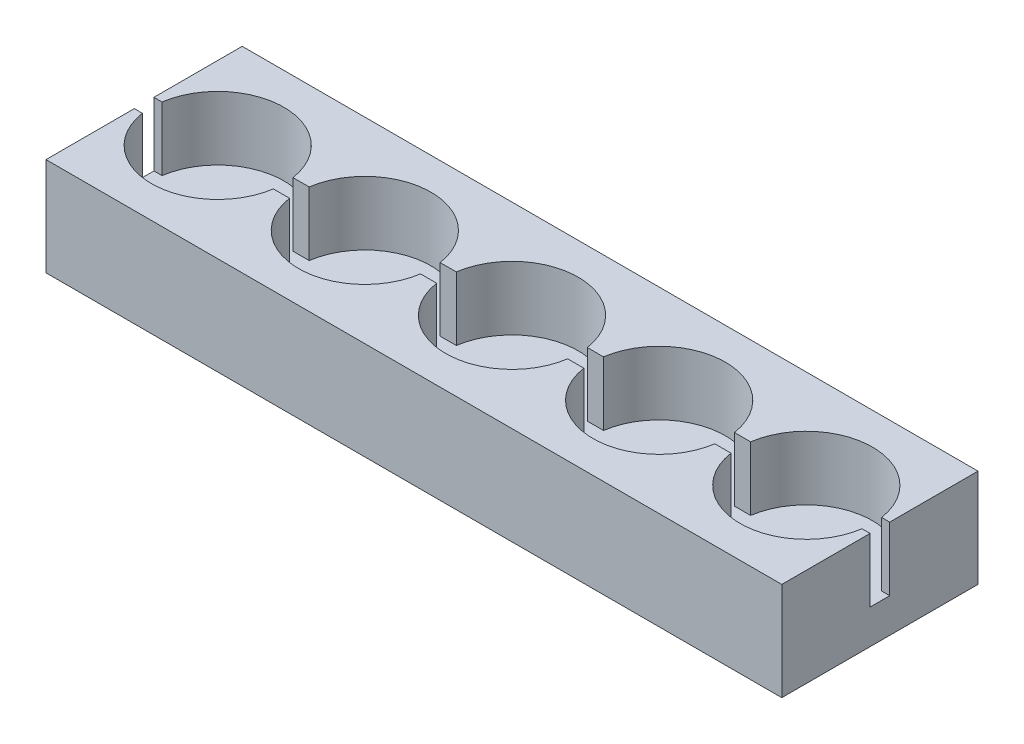
ISO-10303-21;
HEADER;
FILE_DESCRIPTION(('STEP AP214'),'2;1');
FILE_NAME('part.step','',(''),(''),'','','');
FILE_SCHEMA(('AUTOMOTIVE_DESIGN { 1 0 10303 214 1 1 1 1 }'));
ENDSEC;
DATA;
#1=APPLICATION_CONTEXT('core data for automotive mechanical design processes');
#2=APPLICATION_PROTOCOL_DEFINITION('international standard','automotive_design',2000,#1);
#3=PRODUCT_CONTEXT('',#1,'mechanical');
#4=PRODUCT('Part','Part','',(#3));
#5=PRODUCT_RELATED_PRODUCT_CATEGORY('part','',(#4));
#6=PRODUCT_DEFINITION_FORMATION('','',#4);
#7=PRODUCT_DEFINITION_CONTEXT('part definition',#1,'design');
#8=PRODUCT_DEFINITION('design','',#6,#7);
#9=PRODUCT_DEFINITION_SHAPE('','',#8);
#10=(LENGTH_UNIT() NAMED_UNIT(*) SI_UNIT(.MILLI.,.METRE.));
#11=(NAMED_UNIT(*) PLANE_ANGLE_UNIT() SI_UNIT($,.RADIAN.));
#12=(NAMED_UNIT(*) SI_UNIT($,.STERADIAN.) SOLID_ANGLE_UNIT());
#13=UNCERTAINTY_MEASURE_WITH_UNIT(LENGTH_MEASURE(1.E-05),#10,'distance_accuracy_value','');
#14=(GEOMETRIC_REPRESENTATION_CONTEXT(3) GLOBAL_UNCERTAINTY_ASSIGNED_CONTEXT((#13)) GLOBAL_UNIT_ASSIGNED_CONTEXT((#10,
#11,#12)) REPRESENTATION_CONTEXT('',''));
#15=CARTESIAN_POINT('',(0.,0.,0.));
#16=DIRECTION('',(0.,0.,1.));
#17=DIRECTION('',(1.,0.,0.));
#18=AXIS2_PLACEMENT_3D('',#15,#16,#17);
#19=CARTESIAN_POINT('',(75.,20.,20.));
#20=DIRECTION('',(0.,1.,0.));
#21=DIRECTION('',(0.,0.,1.));
#22=AXIS2_PLACEMENT_3D('',#19,#20,#21);
#23=PLANE('',#22);
#24=DIRECTION('',(1.,0.,0.));
#25=VECTOR('',#24,1.);
#26=CARTESIAN_POINT('',(-90.5645069148307,20.,2.));
#27=LINE('',#26,#25);
#28=CARTESIAN_POINT('',(-75.,20.,2.));
#29=VERTEX_POINT('',#28);
#30=CARTESIAN_POINT('',(-73.3510299228187,20.,2.));
#31=VERTEX_POINT('',#30);
#32=EDGE_CURVE('E365',#29,#31,#27,.T.);
#33=ORIENTED_EDGE('',*,*,#32,.F.);
#34=DIRECTION('',(0.,0.,1.));
#35=VECTOR('',#34,1.);
#36=CARTESIAN_POINT('',(-75.,20.,-20.));
#37=LINE('',#36,#35);
#38=CARTESIAN_POINT('',(-75.,20.,20.));
#39=VERTEX_POINT('',#38);
#40=EDGE_CURVE('E239',#29,#39,#37,.T.);
#41=ORIENTED_EDGE('',*,*,#40,.T.);
#42=DIRECTION('',(1.,0.,0.));
#43=VECTOR('',#42,1.);
#44=CARTESIAN_POINT('',(-75.,20.,20.));
#45=LINE('',#44,#43);
#46=CARTESIAN_POINT('',(75.,20.,20.));
#47=VERTEX_POINT('',#46);
#48=EDGE_CURVE('E296',#39,#47,#45,.T.);
#49=ORIENTED_EDGE('',*,*,#48,.T.);
#50=DIRECTION('',(0.,0.,-1.));
#51=VECTOR('',#50,1.);
#52=CARTESIAN_POINT('',(75.,20.,-20.));
#53=LINE('',#52,#51);
#54=CARTESIAN_POINT('',(75.,20.,2.));
#55=VERTEX_POINT('',#54);
#56=EDGE_CURVE('E287',#47,#55,#53,.T.);
#57=ORIENTED_EDGE('',*,*,#56,.T.);
#58=CARTESIAN_POINT('',(73.3510299228186,20.,2.));
#59=VERTEX_POINT('',#58);
#60=EDGE_CURVE('E360',#59,#55,#27,.T.);
#61=ORIENTED_EDGE('',*,*,#60,.F.);
#62=CARTESIAN_POINT('',(60.,20.,0.));
#63=DIRECTION('',(0.,1.,0.));
#64=DIRECTION('',(0.,0.,1.));
#65=AXIS2_PLACEMENT_3D('',#62,#63,#64);
#66=CIRCLE('',#65,13.5);
#67=CARTESIAN_POINT('',(46.6489700771813,20.,2.));
#68=VERTEX_POINT('',#67);
#69=EDGE_CURVE('E335',#68,#59,#66,.T.);
#70=ORIENTED_EDGE('',*,*,#69,.F.);
#71=CARTESIAN_POINT('',(43.3510299228186,20.,2.));
#72=VERTEX_POINT('',#71);
#73=EDGE_CURVE('E359',#72,#68,#27,.T.);
#74=ORIENTED_EDGE('',*,*,#73,.F.);
#75=CARTESIAN_POINT('',(30.,20.,0.));
#76=DIRECTION('',(0.,1.,0.));
#77=DIRECTION('',(0.,0.,1.));
#78=AXIS2_PLACEMENT_3D('',#75,#76,#77);
#79=CIRCLE('',#78,13.5);
#80=CARTESIAN_POINT('',(16.6489700771813,20.,2.));
#81=VERTEX_POINT('',#80);
#82=EDGE_CURVE('E327',#81,#72,#79,.T.);
#83=ORIENTED_EDGE('',*,*,#82,.F.);
#84=CARTESIAN_POINT('',(13.3510299228186,20.,2.));
#85=VERTEX_POINT('',#84);
#86=EDGE_CURVE('E366',#85,#81,#27,.T.);
#87=ORIENTED_EDGE('',*,*,#86,.F.);
#88=CARTESIAN_POINT('',(0.,20.,0.));
#89=DIRECTION('',(0.,1.,0.));
#90=DIRECTION('',(0.,0.,1.));
#91=AXIS2_PLACEMENT_3D('',#88,#89,#90);
#92=CIRCLE('',#91,13.5);
#93=CARTESIAN_POINT('',(-13.3510299228187,20.,2.));
#94=VERTEX_POINT('',#93);
#95=EDGE_CURVE('E319',#94,#85,#92,.T.);
#96=ORIENTED_EDGE('',*,*,#95,.F.);
#97=CARTESIAN_POINT('',(-16.6489700771813,20.,2.));
#98=VERTEX_POINT('',#97);
#99=EDGE_CURVE('E374',#98,#94,#27,.T.);
#100=ORIENTED_EDGE('',*,*,#99,.F.);
#101=CARTESIAN_POINT('',(-30.,20.,0.));
#102=DIRECTION('',(0.,1.,0.));
#103=DIRECTION('',(0.,0.,1.));
#104=AXIS2_PLACEMENT_3D('',#101,#102,#103);
#105=CIRCLE('',#104,13.5);
#106=CARTESIAN_POINT('',(-43.3510299228187,20.,2.));
#107=VERTEX_POINT('',#106);
#108=EDGE_CURVE('E273',#107,#98,#105,.T.);
#109=ORIENTED_EDGE('',*,*,#108,.F.);
#110=CARTESIAN_POINT('',(-46.6489700771813,20.,2.));
#111=VERTEX_POINT('',#110);
#112=EDGE_CURVE('E370',#111,#107,#27,.T.);
#113=ORIENTED_EDGE('',*,*,#112,.F.);
#114=CARTESIAN_POINT('',(-60.,20.,0.));
#115=DIRECTION('',(0.,1.,0.));
#116=DIRECTION('',(0.,0.,1.));
#117=AXIS2_PLACEMENT_3D('',#114,#115,#116);
#118=CIRCLE('',#117,13.5);
#119=EDGE_CURVE('E284',#31,#111,#118,.T.);
#120=ORIENTED_EDGE('',*,*,#119,.F.);
#121=EDGE_LOOP('',(#33,#41,#49,#57,#61,#70,#74,#83,#87,#96,#100,#109,#113,#120));
#122=FACE_BOUND('',#121,.T.);
#123=ADVANCED_FACE('F33',(#122),#23,.T.);
#124=CARTESIAN_POINT('',(-60.,7.,0.));
#125=DIRECTION('',(0.,1.,0.));
#126=DIRECTION('',(0.,0.,1.));
#127=AXIS2_PLACEMENT_3D('',#124,#125,#126);
#128=CYLINDRICAL_SURFACE('',#127,13.5);
#129=ORIENTED_EDGE('',*,*,#119,.T.);
#130=DIRECTION('',(0.,1.,0.));
#131=VECTOR('',#130,1.);
#132=CARTESIAN_POINT('',(-46.6489700771814,7.,2.));
#133=LINE('',#132,#131);
#134=CARTESIAN_POINT('',(-46.6489700771813,7.,2.));
#135=VERTEX_POINT('',#134);
#136=EDGE_CURVE('E241',#111,#135,#133,.F.);
#137=ORIENTED_EDGE('',*,*,#136,.T.);
#138=CARTESIAN_POINT('',(-60.,7.,0.));
#139=DIRECTION('',(0.,1.,0.));
#140=DIRECTION('',(0.,0.,1.));
#141=AXIS2_PLACEMENT_3D('',#138,#139,#140);
#142=CIRCLE('',#141,13.5);
#143=CARTESIAN_POINT('',(-73.3510299228187,7.,2.));
#144=VERTEX_POINT('',#143);
#145=EDGE_CURVE('E280',#144,#135,#142,.T.);
#146=ORIENTED_EDGE('',*,*,#145,.F.);
#147=DIRECTION('',(0.,1.,0.));
#148=VECTOR('',#147,1.);
#149=CARTESIAN_POINT('',(-73.3510299228187,7.,2.));
#150=LINE('',#149,#148);
#151=EDGE_CURVE('E232',#144,#31,#150,.T.);
#152=ORIENTED_EDGE('',*,*,#151,.T.);
#153=EDGE_LOOP('',(#129,#137,#146,#152));
#154=FACE_BOUND('',#153,.T.);
#155=ADVANCED_FACE('F413',(#154),#128,.F.);
#156=CARTESIAN_POINT('',(-30.,7.,0.));
#157=DIRECTION('',(0.,1.,0.));
#158=DIRECTION('',(0.,0.,1.));
#159=AXIS2_PLACEMENT_3D('',#156,#157,#158);
#160=CYLINDRICAL_SURFACE('',#159,13.5);
#161=ORIENTED_EDGE('',*,*,#108,.T.);
#162=DIRECTION('',(0.,1.,0.));
#163=VECTOR('',#162,1.);
#164=CARTESIAN_POINT('',(-16.6489700771814,7.,2.));
#165=LINE('',#164,#163);
#166=CARTESIAN_POINT('',(-16.6489700771813,7.,2.));
#167=VERTEX_POINT('',#166);
#168=EDGE_CURVE('E409',#98,#167,#165,.F.);
#169=ORIENTED_EDGE('',*,*,#168,.T.);
#170=CARTESIAN_POINT('',(-30.,7.,0.));
#171=DIRECTION('',(0.,1.,0.));
#172=DIRECTION('',(0.,0.,1.));
#173=AXIS2_PLACEMENT_3D('',#170,#171,#172);
#174=CIRCLE('',#173,13.5);
#175=CARTESIAN_POINT('',(-43.3510299228187,7.,2.));
#176=VERTEX_POINT('',#175);
#177=EDGE_CURVE('E277',#176,#167,#174,.T.);
#178=ORIENTED_EDGE('',*,*,#177,.F.);
#179=DIRECTION('',(0.,1.,0.));
#180=VECTOR('',#179,1.);
#181=CARTESIAN_POINT('',(-43.3510299228187,7.,2.));
#182=LINE('',#181,#180);
#183=EDGE_CURVE('E407',#176,#107,#182,.T.);
#184=ORIENTED_EDGE('',*,*,#183,.T.);
#185=EDGE_LOOP('',(#161,#169,#178,#184));
#186=FACE_BOUND('',#185,.T.);
#187=ADVANCED_FACE('F416',(#186),#160,.F.);
#188=CARTESIAN_POINT('',(0.,7.,0.));
#189=DIRECTION('',(0.,1.,0.));
#190=DIRECTION('',(0.,0.,1.));
#191=AXIS2_PLACEMENT_3D('',#188,#189,#190);
#192=CYLINDRICAL_SURFACE('',#191,13.5);
#193=ORIENTED_EDGE('',*,*,#95,.T.);
#194=DIRECTION('',(0.,1.,0.));
#195=VECTOR('',#194,1.);
#196=CARTESIAN_POINT('',(13.3510299228186,7.,2.));
#197=LINE('',#196,#195);
#198=CARTESIAN_POINT('',(13.3510299228186,7.,2.));
#199=VERTEX_POINT('',#198);
#200=EDGE_CURVE('E390',#85,#199,#197,.F.);
#201=ORIENTED_EDGE('',*,*,#200,.T.);
#202=CARTESIAN_POINT('',(0.,7.,0.));
#203=DIRECTION('',(0.,1.,0.));
#204=DIRECTION('',(0.,0.,1.));
#205=AXIS2_PLACEMENT_3D('',#202,#203,#204);
#206=CIRCLE('',#205,13.5);
#207=CARTESIAN_POINT('',(-13.3510299228187,7.,2.));
#208=VERTEX_POINT('',#207);
#209=EDGE_CURVE('E323',#208,#199,#206,.T.);
#210=ORIENTED_EDGE('',*,*,#209,.F.);
#211=DIRECTION('',(0.,1.,0.));
#212=VECTOR('',#211,1.);
#213=CARTESIAN_POINT('',(-13.3510299228187,7.,2.));
#214=LINE('',#213,#212);
#215=EDGE_CURVE('E398',#208,#94,#214,.T.);
#216=ORIENTED_EDGE('',*,*,#215,.T.);
#217=EDGE_LOOP('',(#193,#201,#210,#216));
#218=FACE_BOUND('',#217,.T.);
#219=ADVANCED_FACE('F506',(#218),#192,.F.);
#220=CARTESIAN_POINT('',(30.,7.,0.));
#221=DIRECTION('',(0.,1.,0.));
#222=DIRECTION('',(0.,0.,1.));
#223=AXIS2_PLACEMENT_3D('',#220,#221,#222);
#224=CYLINDRICAL_SURFACE('',#223,13.5);
#225=ORIENTED_EDGE('',*,*,#82,.T.);
#226=DIRECTION('',(0.,1.,0.));
#227=VECTOR('',#226,1.);
#228=CARTESIAN_POINT('',(43.3510299228186,7.,2.));
#229=LINE('',#228,#227);
#230=CARTESIAN_POINT('',(43.3510299228186,7.,2.));
#231=VERTEX_POINT('',#230);
#232=EDGE_CURVE('E395',#72,#231,#229,.F.);
#233=ORIENTED_EDGE('',*,*,#232,.T.);
#234=CARTESIAN_POINT('',(30.,7.,0.));
#235=DIRECTION('',(0.,1.,0.));
#236=DIRECTION('',(0.,0.,1.));
#237=AXIS2_PLACEMENT_3D('',#234,#235,#236);
#238=CIRCLE('',#237,13.5);
#239=CARTESIAN_POINT('',(16.6489700771813,7.,2.));
#240=VERTEX_POINT('',#239);
#241=EDGE_CURVE('E331',#240,#231,#238,.T.);
#242=ORIENTED_EDGE('',*,*,#241,.F.);
#243=DIRECTION('',(0.,1.,0.));
#244=VECTOR('',#243,1.);
#245=CARTESIAN_POINT('',(16.6489700771813,7.,2.));
#246=LINE('',#245,#244);
#247=EDGE_CURVE('E387',#240,#81,#246,.T.);
#248=ORIENTED_EDGE('',*,*,#247,.T.);
#249=EDGE_LOOP('',(#225,#233,#242,#248));
#250=FACE_BOUND('',#249,.T.);
#251=ADVANCED_FACE('F393',(#250),#224,.F.);
#252=CARTESIAN_POINT('',(60.,7.,0.));
#253=DIRECTION('',(0.,1.,0.));
#254=DIRECTION('',(0.,0.,1.));
#255=AXIS2_PLACEMENT_3D('',#252,#253,#254);
#256=CYLINDRICAL_SURFACE('',#255,13.5);
#257=ORIENTED_EDGE('',*,*,#69,.T.);
#258=DIRECTION('',(0.,1.,0.));
#259=VECTOR('',#258,1.);
#260=CARTESIAN_POINT('',(73.3510299228186,7.,2.));
#261=LINE('',#260,#259);
#262=CARTESIAN_POINT('',(73.3510299228186,7.,2.));
#263=VERTEX_POINT('',#262);
#264=EDGE_CURVE('E11',#59,#263,#261,.F.);
#265=ORIENTED_EDGE('',*,*,#264,.T.);
#266=CARTESIAN_POINT('',(60.,7.,0.));
#267=DIRECTION('',(0.,1.,0.));
#268=DIRECTION('',(0.,0.,1.));
#269=AXIS2_PLACEMENT_3D('',#266,#267,#268);
#270=CIRCLE('',#269,13.5);
#271=CARTESIAN_POINT('',(46.6489700771813,7.,2.));
#272=VERTEX_POINT('',#271);
#273=EDGE_CURVE('E339',#272,#263,#270,.T.);
#274=ORIENTED_EDGE('',*,*,#273,.F.);
#275=DIRECTION('',(0.,1.,0.));
#276=VECTOR('',#275,1.);
#277=CARTESIAN_POINT('',(46.6489700771813,7.,2.));
#278=LINE('',#277,#276);
#279=EDGE_CURVE('E41',#272,#68,#278,.T.);
#280=ORIENTED_EDGE('',*,*,#279,.T.);
#281=EDGE_LOOP('',(#257,#265,#274,#280));
#282=FACE_BOUND('',#281,.T.);
#283=ADVANCED_FACE('F353',(#282),#256,.F.);
#284=CARTESIAN_POINT('',(75.,20.,-20.));
#285=DIRECTION('',(-1.,0.,0.));
#286=DIRECTION('',(0.,0.,1.));
#287=AXIS2_PLACEMENT_3D('',#284,#285,#286);
#288=PLANE('',#287);
#289=DIRECTION('',(0.,0.,1.));
#290=VECTOR('',#289,1.);
#291=CARTESIAN_POINT('',(75.,7.,-20.));
#292=LINE('',#291,#290);
#293=CARTESIAN_POINT('',(75.,7.,-2.));
#294=VERTEX_POINT('',#293);
#295=CARTESIAN_POINT('',(75.,7.,2.));
#296=VERTEX_POINT('',#295);
#297=EDGE_CURVE('E225',#294,#296,#292,.T.);
#298=ORIENTED_EDGE('',*,*,#297,.T.);
#299=DIRECTION('',(0.,1.,0.));
#300=VECTOR('',#299,1.);
#301=CARTESIAN_POINT('',(75.,20.,2.));
#302=LINE('',#301,#300);
#303=EDGE_CURVE('E240',#296,#55,#302,.T.);
#304=ORIENTED_EDGE('',*,*,#303,.T.);
#305=ORIENTED_EDGE('',*,*,#56,.F.);
#306=DIRECTION('',(0.,-1.,0.));
#307=VECTOR('',#306,1.);
#308=CARTESIAN_POINT('',(75.,20.,20.));
#309=LINE('',#308,#307);
#310=CARTESIAN_POINT('',(75.,0.,20.));
#311=VERTEX_POINT('',#310);
#312=EDGE_CURVE('E298',#47,#311,#309,.T.);
#313=ORIENTED_EDGE('',*,*,#312,.T.);
#314=DIRECTION('',(0.,0.,-1.));
#315=VECTOR('',#314,1.);
#316=CARTESIAN_POINT('',(75.,0.,-20.));
#317=LINE('',#316,#315);
#318=CARTESIAN_POINT('',(75.,0.,-20.));
#319=VERTEX_POINT('',#318);
#320=EDGE_CURVE('E299',#311,#319,#317,.T.);
#321=ORIENTED_EDGE('',*,*,#320,.T.);
#322=DIRECTION('',(0.,-1.,0.));
#323=VECTOR('',#322,1.);
#324=CARTESIAN_POINT('',(75.,20.,-20.));
#325=LINE('',#324,#323);
#326=CARTESIAN_POINT('',(75.,20.,-20.));
#327=VERTEX_POINT('',#326);
#328=EDGE_CURVE('E316',#327,#319,#325,.T.);
#329=ORIENTED_EDGE('',*,*,#328,.F.);
#330=CARTESIAN_POINT('',(75.,20.,-2.));
#331=VERTEX_POINT('',#330);
#332=EDGE_CURVE('E291',#331,#327,#53,.T.);
#333=ORIENTED_EDGE('',*,*,#332,.F.);
#334=DIRECTION('',(0.,-1.,0.));
#335=VECTOR('',#334,1.);
#336=CARTESIAN_POINT('',(75.,20.,-2.));
#337=LINE('',#336,#335);
#338=EDGE_CURVE('E396',#331,#294,#337,.T.);
#339=ORIENTED_EDGE('',*,*,#338,.T.);
#340=EDGE_LOOP('',(#298,#304,#305,#313,#321,#329,#333,#339));
#341=FACE_BOUND('',#340,.T.);
#342=ADVANCED_FACE('F501',(#341),#288,.F.);
#343=CARTESIAN_POINT('',(-75.,20.,-20.));
#344=DIRECTION('',(0.,0.,1.));
#345=DIRECTION('',(1.,0.,0.));
#346=AXIS2_PLACEMENT_3D('',#343,#344,#345);
#347=PLANE('',#346);
#348=DIRECTION('',(-1.,0.,0.));
#349=VECTOR('',#348,1.);
#350=CARTESIAN_POINT('',(-75.,0.,-20.));
#351=LINE('',#350,#349);
#352=CARTESIAN_POINT('',(-75.,0.,-20.));
#353=VERTEX_POINT('',#352);
#354=EDGE_CURVE('E302',#319,#353,#351,.T.);
#355=ORIENTED_EDGE('',*,*,#354,.T.);
#356=DIRECTION('',(0.,-1.,0.));
#357=VECTOR('',#356,1.);
#358=CARTESIAN_POINT('',(-75.,20.,-20.));
#359=LINE('',#358,#357);
#360=CARTESIAN_POINT('',(-75.,20.,-20.));
#361=VERTEX_POINT('',#360);
#362=EDGE_CURVE('E313',#361,#353,#359,.T.);
#363=ORIENTED_EDGE('',*,*,#362,.F.);
#364=DIRECTION('',(-1.,0.,0.));
#365=VECTOR('',#364,1.);
#366=CARTESIAN_POINT('',(-75.,20.,-20.));
#367=LINE('',#366,#365);
#368=EDGE_CURVE('E290',#327,#361,#367,.T.);
#369=ORIENTED_EDGE('',*,*,#368,.F.);
#370=ORIENTED_EDGE('',*,*,#328,.T.);
#371=EDGE_LOOP('',(#355,#363,#369,#370));
#372=FACE_BOUND('',#371,.T.);
#373=ADVANCED_FACE('F489',(#372),#347,.F.);
#374=CARTESIAN_POINT('',(-75.,20.,-20.));
#375=DIRECTION('',(1.,0.,0.));
#376=DIRECTION('',(0.,0.,-1.));
#377=AXIS2_PLACEMENT_3D('',#374,#375,#376);
#378=PLANE('',#377);
#379=ORIENTED_EDGE('',*,*,#40,.F.);
#380=DIRECTION('',(0.,-1.,0.));
#381=VECTOR('',#380,1.);
#382=CARTESIAN_POINT('',(-75.,20.,2.));
#383=LINE('',#382,#381);
#384=CARTESIAN_POINT('',(-75.,7.,2.));
#385=VERTEX_POINT('',#384);
#386=EDGE_CURVE('E229',#29,#385,#383,.T.);
#387=ORIENTED_EDGE('',*,*,#386,.T.);
#388=DIRECTION('',(0.,0.,-1.));
#389=VECTOR('',#388,1.);
#390=CARTESIAN_POINT('',(-75.,7.,-20.));
#391=LINE('',#390,#389);
#392=CARTESIAN_POINT('',(-75.,7.,-2.));
#393=VERTEX_POINT('',#392);
#394=EDGE_CURVE('E217',#385,#393,#391,.T.);
#395=ORIENTED_EDGE('',*,*,#394,.T.);
#396=DIRECTION('',(0.,1.,0.));
#397=VECTOR('',#396,1.);
#398=CARTESIAN_POINT('',(-75.,20.,-2.));
#399=LINE('',#398,#397);
#400=CARTESIAN_POINT('',(-75.,20.,-2.));
#401=VERTEX_POINT('',#400);
#402=EDGE_CURVE('E401',#393,#401,#399,.T.);
#403=ORIENTED_EDGE('',*,*,#402,.T.);
#404=EDGE_CURVE('E293',#361,#401,#37,.T.);
#405=ORIENTED_EDGE('',*,*,#404,.F.);
#406=ORIENTED_EDGE('',*,*,#362,.T.);
#407=DIRECTION('',(0.,0.,1.));
#408=VECTOR('',#407,1.);
#409=CARTESIAN_POINT('',(-75.,0.,-20.));
#410=LINE('',#409,#408);
#411=CARTESIAN_POINT('',(-75.,0.,20.));
#412=VERTEX_POINT('',#411);
#413=EDGE_CURVE('E304',#353,#412,#410,.T.);
#414=ORIENTED_EDGE('',*,*,#413,.T.);
#415=DIRECTION('',(0.,-1.,0.));
#416=VECTOR('',#415,1.);
#417=CARTESIAN_POINT('',(-75.,20.,20.));
#418=LINE('',#417,#416);
#419=EDGE_CURVE('E310',#39,#412,#418,.T.);
#420=ORIENTED_EDGE('',*,*,#419,.F.);
#421=EDGE_LOOP('',(#379,#387,#395,#403,#405,#406,#414,#420));
#422=FACE_BOUND('',#421,.T.);
#423=ADVANCED_FACE('F237',(#422),#378,.F.);
#424=CARTESIAN_POINT('',(-75.,20.,20.));
#425=DIRECTION('',(0.,0.,-1.));
#426=DIRECTION('',(-1.,0.,0.));
#427=AXIS2_PLACEMENT_3D('',#424,#425,#426);
#428=PLANE('',#427);
#429=DIRECTION('',(1.,0.,0.));
#430=VECTOR('',#429,1.);
#431=CARTESIAN_POINT('',(-75.,0.,20.));
#432=LINE('',#431,#430);
#433=EDGE_CURVE('E306',#412,#311,#432,.T.);
#434=ORIENTED_EDGE('',*,*,#433,.T.);
#435=ORIENTED_EDGE('',*,*,#312,.F.);
#436=ORIENTED_EDGE('',*,*,#48,.F.);
#437=ORIENTED_EDGE('',*,*,#419,.T.);
#438=EDGE_LOOP('',(#434,#435,#436,#437));
#439=FACE_BOUND('',#438,.T.);
#440=ADVANCED_FACE('F497',(#439),#428,.F.);
#441=DIRECTION('',(-1.,0.,0.));
#442=VECTOR('',#441,1.);
#443=CARTESIAN_POINT('',(-90.5645069148307,20.,-2.));
#444=LINE('',#443,#442);
#445=CARTESIAN_POINT('',(73.3510299228186,20.,-2.));
#446=VERTEX_POINT('',#445);
#447=EDGE_CURVE('E363',#331,#446,#444,.T.);
#448=ORIENTED_EDGE('',*,*,#447,.F.);
#449=ORIENTED_EDGE('',*,*,#332,.T.);
#450=ORIENTED_EDGE('',*,*,#368,.T.);
#451=ORIENTED_EDGE('',*,*,#404,.T.);
#452=CARTESIAN_POINT('',(-73.3510299228187,20.,-2.));
#453=VERTEX_POINT('',#452);
#454=EDGE_CURVE('E369',#453,#401,#444,.T.);
#455=ORIENTED_EDGE('',*,*,#454,.F.);
#456=CARTESIAN_POINT('',(-46.6489700771814,20.,-2.));
#457=VERTEX_POINT('',#456);
#458=EDGE_CURVE('E283',#457,#453,#118,.T.);
#459=ORIENTED_EDGE('',*,*,#458,.F.);
#460=CARTESIAN_POINT('',(-43.3510299228187,20.,-2.));
#461=VERTEX_POINT('',#460);
#462=EDGE_CURVE('E423',#461,#457,#444,.T.);
#463=ORIENTED_EDGE('',*,*,#462,.F.);
#464=CARTESIAN_POINT('',(-16.6489700771814,20.,-2.));
#465=VERTEX_POINT('',#464);
#466=EDGE_CURVE('E276',#465,#461,#105,.T.);
#467=ORIENTED_EDGE('',*,*,#466,.F.);
#468=CARTESIAN_POINT('',(-13.3510299228187,20.,-2.));
#469=VERTEX_POINT('',#468);
#470=EDGE_CURVE('E426',#469,#465,#444,.T.);
#471=ORIENTED_EDGE('',*,*,#470,.F.);
#472=CARTESIAN_POINT('',(13.3510299228186,20.,-2.));
#473=VERTEX_POINT('',#472);
#474=EDGE_CURVE('E322',#473,#469,#92,.T.);
#475=ORIENTED_EDGE('',*,*,#474,.F.);
#476=CARTESIAN_POINT('',(16.6489700771813,20.,-2.));
#477=VERTEX_POINT('',#476);
#478=EDGE_CURVE('E430',#477,#473,#444,.T.);
#479=ORIENTED_EDGE('',*,*,#478,.F.);
#480=CARTESIAN_POINT('',(43.3510299228186,20.,-2.));
#481=VERTEX_POINT('',#480);
#482=EDGE_CURVE('E330',#481,#477,#79,.T.);
#483=ORIENTED_EDGE('',*,*,#482,.F.);
#484=CARTESIAN_POINT('',(46.6489700771813,20.,-2.));
#485=VERTEX_POINT('',#484);
#486=EDGE_CURVE('E367',#485,#481,#444,.T.);
#487=ORIENTED_EDGE('',*,*,#486,.F.);
#488=EDGE_CURVE('E338',#446,#485,#66,.T.);
#489=ORIENTED_EDGE('',*,*,#488,.F.);
#490=EDGE_LOOP('',(#448,#449,#450,#451,#455,#459,#463,#467,#471,#475,#479,#483,#487,#489));
#491=FACE_BOUND('',#490,.T.);
#492=ADVANCED_FACE('F456',(#491),#23,.T.);
#493=CARTESIAN_POINT('',(75.,0.,20.));
#494=DIRECTION('',(0.,1.,0.));
#495=DIRECTION('',(0.,0.,1.));
#496=AXIS2_PLACEMENT_3D('',#493,#494,#495);
#497=PLANE('',#496);
#498=CARTESIAN_POINT('',(60.,0.,0.));
#499=DIRECTION('',(0.,1.,0.));
#500=DIRECTION('',(0.,0.,1.));
#501=AXIS2_PLACEMENT_3D('',#498,#499,#500);
#502=CIRCLE('',#501,2.25);
#503=CARTESIAN_POINT('',(60.,0.,2.25));
#504=VERTEX_POINT('',#503);
#505=EDGE_CURVE('E258',#504,#504,#502,.T.);
#506=ORIENTED_EDGE('',*,*,#505,.T.);
#507=EDGE_LOOP('',(#506));
#508=FACE_BOUND('',#507,.T.);
#509=CARTESIAN_POINT('',(-60.,0.,0.));
#510=DIRECTION('',(0.,1.,0.));
#511=DIRECTION('',(0.,0.,1.));
#512=AXIS2_PLACEMENT_3D('',#509,#510,#511);
#513=CIRCLE('',#512,2.25);
#514=CARTESIAN_POINT('',(-60.,0.,2.25));
#515=VERTEX_POINT('',#514);
#516=EDGE_CURVE('E270',#515,#515,#513,.T.);
#517=ORIENTED_EDGE('',*,*,#516,.T.);
#518=EDGE_LOOP('',(#517));
#519=FACE_BOUND('',#518,.T.);
#520=ORIENTED_EDGE('',*,*,#320,.F.);
#521=ORIENTED_EDGE('',*,*,#433,.F.);
#522=ORIENTED_EDGE('',*,*,#413,.F.);
#523=ORIENTED_EDGE('',*,*,#354,.F.);
#524=EDGE_LOOP('',(#520,#521,#522,#523));
#525=FACE_BOUND('',#524,.T.);
#526=ADVANCED_FACE('F494',(#508,#519,#525),#497,.F.);
#527=ORIENTED_EDGE('',*,*,#458,.T.);
#528=DIRECTION('',(0.,1.,0.));
#529=VECTOR('',#528,1.);
#530=CARTESIAN_POINT('',(-73.3510299228187,7.,-2.));
#531=LINE('',#530,#529);
#532=CARTESIAN_POINT('',(-73.3510299228187,7.,-2.));
#533=VERTEX_POINT('',#532);
#534=EDGE_CURVE('E479',#453,#533,#531,.F.);
#535=ORIENTED_EDGE('',*,*,#534,.T.);
#536=CARTESIAN_POINT('',(-46.6489700771814,7.,-2.));
#537=VERTEX_POINT('',#536);
#538=EDGE_CURVE('E282',#537,#533,#142,.T.);
#539=ORIENTED_EDGE('',*,*,#538,.F.);
#540=DIRECTION('',(0.,1.,0.));
#541=VECTOR('',#540,1.);
#542=CARTESIAN_POINT('',(-46.6489700771814,7.,-2.));
#543=LINE('',#542,#541);
#544=EDGE_CURVE('E477',#537,#457,#543,.T.);
#545=ORIENTED_EDGE('',*,*,#544,.T.);
#546=EDGE_LOOP('',(#527,#535,#539,#545));
#547=FACE_BOUND('',#546,.T.);
#548=ADVANCED_FACE('F528',(#547),#128,.F.);
#549=CARTESIAN_POINT('',(-60.,7.,0.));
#550=DIRECTION('',(0.,1.,0.));
#551=DIRECTION('',(0.,0.,1.));
#552=AXIS2_PLACEMENT_3D('',#549,#550,#551);
#553=PLANE('',#552);
#554=CARTESIAN_POINT('',(-60.,7.,0.));
#555=DIRECTION('',(0.,1.,0.));
#556=DIRECTION('',(0.,0.,1.));
#557=AXIS2_PLACEMENT_3D('',#554,#555,#556);
#558=CIRCLE('',#557,4.);
#559=CARTESIAN_POINT('',(-60.,7.,4.));
#560=VERTEX_POINT('',#559);
#561=EDGE_CURVE('E261',#560,#560,#558,.T.);
#562=ORIENTED_EDGE('',*,*,#561,.F.);
#563=EDGE_LOOP('',(#562));
#564=FACE_BOUND('',#563,.T.);
#565=ORIENTED_EDGE('',*,*,#538,.T.);
#566=DIRECTION('',(-1.,0.,0.));
#567=VECTOR('',#566,1.);
#568=CARTESIAN_POINT('',(-90.5645069148307,7.,-2.));
#569=LINE('',#568,#567);
#570=EDGE_CURVE('E221',#533,#393,#569,.T.);
#571=ORIENTED_EDGE('',*,*,#570,.T.);
#572=ORIENTED_EDGE('',*,*,#394,.F.);
#573=DIRECTION('',(1.,0.,0.));
#574=VECTOR('',#573,1.);
#575=CARTESIAN_POINT('',(-90.5645069148307,7.,2.));
#576=LINE('',#575,#574);
#577=EDGE_CURVE('E48',#385,#144,#576,.T.);
#578=ORIENTED_EDGE('',*,*,#577,.T.);
#579=ORIENTED_EDGE('',*,*,#145,.T.);
#580=EDGE_CURVE('E54',#135,#176,#576,.T.);
#581=ORIENTED_EDGE('',*,*,#580,.T.);
#582=ORIENTED_EDGE('',*,*,#177,.T.);
#583=EDGE_CURVE('E419',#167,#208,#576,.T.);
#584=ORIENTED_EDGE('',*,*,#583,.T.);
#585=ORIENTED_EDGE('',*,*,#209,.T.);
#586=EDGE_CURVE('E420',#199,#240,#576,.T.);
#587=ORIENTED_EDGE('',*,*,#586,.T.);
#588=ORIENTED_EDGE('',*,*,#241,.T.);
#589=EDGE_CURVE('E422',#231,#272,#576,.T.);
#590=ORIENTED_EDGE('',*,*,#589,.T.);
#591=ORIENTED_EDGE('',*,*,#273,.T.);
#592=EDGE_CURVE('E235',#263,#296,#576,.T.);
#593=ORIENTED_EDGE('',*,*,#592,.T.);
#594=ORIENTED_EDGE('',*,*,#297,.F.);
#595=CARTESIAN_POINT('',(73.3510299228186,7.,-2.));
#596=VERTEX_POINT('',#595);
#597=EDGE_CURVE('E373',#294,#596,#569,.T.);
#598=ORIENTED_EDGE('',*,*,#597,.T.);
#599=CARTESIAN_POINT('',(46.6489700771813,7.,-2.));
#600=VERTEX_POINT('',#599);
#601=EDGE_CURVE('E342',#596,#600,#270,.T.);
#602=ORIENTED_EDGE('',*,*,#601,.T.);
#603=CARTESIAN_POINT('',(43.3510299228186,7.,-2.));
#604=VERTEX_POINT('',#603);
#605=EDGE_CURVE('E582',#600,#604,#569,.T.);
#606=ORIENTED_EDGE('',*,*,#605,.T.);
#607=CARTESIAN_POINT('',(16.6489700771813,7.,-2.));
#608=VERTEX_POINT('',#607);
#609=EDGE_CURVE('E334',#604,#608,#238,.T.);
#610=ORIENTED_EDGE('',*,*,#609,.T.);
#611=CARTESIAN_POINT('',(13.3510299228186,7.,-2.));
#612=VERTEX_POINT('',#611);
#613=EDGE_CURVE('E581',#608,#612,#569,.T.);
#614=ORIENTED_EDGE('',*,*,#613,.T.);
#615=CARTESIAN_POINT('',(-13.3510299228187,7.,-2.));
#616=VERTEX_POINT('',#615);
#617=EDGE_CURVE('E326',#612,#616,#206,.T.);
#618=ORIENTED_EDGE('',*,*,#617,.T.);
#619=CARTESIAN_POINT('',(-16.6489700771814,7.,-2.));
#620=VERTEX_POINT('',#619);
#621=EDGE_CURVE('E580',#616,#620,#569,.T.);
#622=ORIENTED_EDGE('',*,*,#621,.T.);
#623=CARTESIAN_POINT('',(-43.3510299228187,7.,-2.));
#624=VERTEX_POINT('',#623);
#625=EDGE_CURVE('E279',#620,#624,#174,.T.);
#626=ORIENTED_EDGE('',*,*,#625,.T.);
#627=EDGE_CURVE('E371',#624,#537,#569,.T.);
#628=ORIENTED_EDGE('',*,*,#627,.T.);
#629=EDGE_LOOP('',(#565,#571,#572,#578,#579,#581,#582,#584,#585,#587,#588,#590,#591,#593,#594,
#598,#602,#606,#610,#614,#618,#622,#626,#628));
#630=FACE_BOUND('',#629,.T.);
#631=CARTESIAN_POINT('',(60.,7.,0.));
#632=DIRECTION('',(0.,1.,0.));
#633=DIRECTION('',(0.,0.,1.));
#634=AXIS2_PLACEMENT_3D('',#631,#632,#633);
#635=CIRCLE('',#634,4.);
#636=CARTESIAN_POINT('',(60.,7.,4.));
#637=VERTEX_POINT('',#636);
#638=EDGE_CURVE('E244',#637,#637,#635,.T.);
#639=ORIENTED_EDGE('',*,*,#638,.F.);
#640=EDGE_LOOP('',(#639));
#641=FACE_BOUND('',#640,.T.);
#642=ADVANCED_FACE('F219',(#564,#630,#641),#553,.T.);
#643=ORIENTED_EDGE('',*,*,#466,.T.);
#644=DIRECTION('',(0.,1.,0.));
#645=VECTOR('',#644,1.);
#646=CARTESIAN_POINT('',(-43.3510299228187,7.,-2.));
#647=LINE('',#646,#645);
#648=EDGE_CURVE('E474',#461,#624,#647,.F.);
#649=ORIENTED_EDGE('',*,*,#648,.T.);
#650=ORIENTED_EDGE('',*,*,#625,.F.);
#651=DIRECTION('',(0.,1.,0.));
#652=VECTOR('',#651,1.);
#653=CARTESIAN_POINT('',(-16.6489700771814,7.,-2.));
#654=LINE('',#653,#652);
#655=EDGE_CURVE('E469',#620,#465,#654,.T.);
#656=ORIENTED_EDGE('',*,*,#655,.T.);
#657=EDGE_LOOP('',(#643,#649,#650,#656));
#658=FACE_BOUND('',#657,.T.);
#659=ADVANCED_FACE('F547',(#658),#160,.F.);
#660=ORIENTED_EDGE('',*,*,#474,.T.);
#661=DIRECTION('',(0.,1.,0.));
#662=VECTOR('',#661,1.);
#663=CARTESIAN_POINT('',(-13.3510299228187,7.,-2.));
#664=LINE('',#663,#662);
#665=EDGE_CURVE('E464',#469,#616,#664,.F.);
#666=ORIENTED_EDGE('',*,*,#665,.T.);
#667=ORIENTED_EDGE('',*,*,#617,.F.);
#668=DIRECTION('',(0.,1.,0.));
#669=VECTOR('',#668,1.);
#670=CARTESIAN_POINT('',(13.3510299228186,7.,-2.));
#671=LINE('',#670,#669);
#672=EDGE_CURVE('E466',#612,#473,#671,.T.);
#673=ORIENTED_EDGE('',*,*,#672,.T.);
#674=EDGE_LOOP('',(#660,#666,#667,#673));
#675=FACE_BOUND('',#674,.T.);
#676=ADVANCED_FACE('F462',(#675),#192,.F.);
#677=ORIENTED_EDGE('',*,*,#482,.T.);
#678=DIRECTION('',(0.,1.,0.));
#679=VECTOR('',#678,1.);
#680=CARTESIAN_POINT('',(16.6489700771813,7.,-2.));
#681=LINE('',#680,#679);
#682=EDGE_CURVE('E453',#477,#608,#681,.F.);
#683=ORIENTED_EDGE('',*,*,#682,.T.);
#684=ORIENTED_EDGE('',*,*,#609,.F.);
#685=DIRECTION('',(0.,1.,0.));
#686=VECTOR('',#685,1.);
#687=CARTESIAN_POINT('',(43.3510299228186,7.,-2.));
#688=LINE('',#687,#686);
#689=EDGE_CURVE('E441',#604,#481,#688,.T.);
#690=ORIENTED_EDGE('',*,*,#689,.T.);
#691=EDGE_LOOP('',(#677,#683,#684,#690));
#692=FACE_BOUND('',#691,.T.);
#693=ADVANCED_FACE('F450',(#692),#224,.F.);
#694=ORIENTED_EDGE('',*,*,#488,.T.);
#695=DIRECTION('',(0.,1.,0.));
#696=VECTOR('',#695,1.);
#697=CARTESIAN_POINT('',(46.6489700771813,7.,-2.));
#698=LINE('',#697,#696);
#699=EDGE_CURVE('E346',#485,#600,#698,.F.);
#700=ORIENTED_EDGE('',*,*,#699,.T.);
#701=ORIENTED_EDGE('',*,*,#601,.F.);
#702=DIRECTION('',(0.,1.,0.));
#703=VECTOR('',#702,1.);
#704=CARTESIAN_POINT('',(73.3510299228186,7.,-2.));
#705=LINE('',#704,#703);
#706=EDGE_CURVE('E343',#596,#446,#705,.T.);
#707=ORIENTED_EDGE('',*,*,#706,.T.);
#708=EDGE_LOOP('',(#694,#700,#701,#707));
#709=FACE_BOUND('',#708,.T.);
#710=ADVANCED_FACE('F35',(#709),#256,.F.);
#711=CARTESIAN_POINT('',(-60.,7.,0.));
#712=DIRECTION('',(0.,1.,0.));
#713=DIRECTION('',(0.,0.,1.));
#714=AXIS2_PLACEMENT_3D('',#711,#712,#713);
#715=CYLINDRICAL_SURFACE('',#714,2.25);
#716=ORIENTED_EDGE('',*,*,#516,.F.);
#717=EDGE_LOOP('',(#716));
#718=FACE_BOUND('',#717,.T.);
#719=CARTESIAN_POINT('',(-60.,2.6,0.));
#720=DIRECTION('',(0.,1.,0.));
#721=DIRECTION('',(0.,0.,1.));
#722=AXIS2_PLACEMENT_3D('',#719,#720,#721);
#723=CIRCLE('',#722,2.25);
#724=CARTESIAN_POINT('',(-60.,2.6,2.25));
#725=VERTEX_POINT('',#724);
#726=EDGE_CURVE('E267',#725,#725,#723,.T.);
#727=ORIENTED_EDGE('',*,*,#726,.T.);
#728=EDGE_LOOP('',(#727));
#729=FACE_BOUND('',#728,.T.);
#730=ADVANCED_FACE('F552',(#718,#729),#715,.F.);
#731=CARTESIAN_POINT('',(-57.75,2.6,0.));
#732=DIRECTION('',(0.,-1.,0.));
#733=DIRECTION('',(0.,0.,-1.));
#734=AXIS2_PLACEMENT_3D('',#731,#732,#733);
#735=PLANE('',#734);
#736=ORIENTED_EDGE('',*,*,#726,.F.);
#737=EDGE_LOOP('',(#736));
#738=FACE_BOUND('',#737,.T.);
#739=CARTESIAN_POINT('',(-60.,2.6,0.));
#740=DIRECTION('',(0.,1.,0.));
#741=DIRECTION('',(0.,0.,1.));
#742=AXIS2_PLACEMENT_3D('',#739,#740,#741);
#743=CIRCLE('',#742,4.);
#744=CARTESIAN_POINT('',(-60.,2.6,4.));
#745=VERTEX_POINT('',#744);
#746=EDGE_CURVE('E264',#745,#745,#743,.T.);
#747=ORIENTED_EDGE('',*,*,#746,.T.);
#748=EDGE_LOOP('',(#747));
#749=FACE_BOUND('',#748,.T.);
#750=ADVANCED_FACE('F713',(#738,#749),#735,.F.);
#751=CARTESIAN_POINT('',(-60.,7.,0.));
#752=DIRECTION('',(0.,1.,0.));
#753=DIRECTION('',(0.,0.,1.));
#754=AXIS2_PLACEMENT_3D('',#751,#752,#753);
#755=CYLINDRICAL_SURFACE('',#754,4.);
#756=ORIENTED_EDGE('',*,*,#746,.F.);
#757=EDGE_LOOP('',(#756));
#758=FACE_BOUND('',#757,.T.);
#759=ORIENTED_EDGE('',*,*,#561,.T.);
#760=EDGE_LOOP('',(#759));
#761=FACE_BOUND('',#760,.T.);
#762=ADVANCED_FACE('F708',(#758,#761),#755,.F.);
#763=CARTESIAN_POINT('',(60.,7.,0.));
#764=DIRECTION('',(0.,1.,0.));
#765=DIRECTION('',(0.,0.,1.));
#766=AXIS2_PLACEMENT_3D('',#763,#764,#765);
#767=CYLINDRICAL_SURFACE('',#766,2.25);
#768=ORIENTED_EDGE('',*,*,#505,.F.);
#769=EDGE_LOOP('',(#768));
#770=FACE_BOUND('',#769,.T.);
#771=CARTESIAN_POINT('',(60.,2.6,0.));
#772=DIRECTION('',(0.,1.,0.));
#773=DIRECTION('',(0.,0.,1.));
#774=AXIS2_PLACEMENT_3D('',#771,#772,#773);
#775=CIRCLE('',#774,2.25);
#776=CARTESIAN_POINT('',(60.,2.6,2.25));
#777=VERTEX_POINT('',#776);
#778=EDGE_CURVE('E255',#777,#777,#775,.T.);
#779=ORIENTED_EDGE('',*,*,#778,.T.);
#780=EDGE_LOOP('',(#779));
#781=FACE_BOUND('',#780,.T.);
#782=ADVANCED_FACE('F712',(#770,#781),#767,.F.);
#783=CARTESIAN_POINT('',(62.25,2.6,0.));
#784=DIRECTION('',(0.,-1.,0.));
#785=DIRECTION('',(0.,0.,-1.));
#786=AXIS2_PLACEMENT_3D('',#783,#784,#785);
#787=PLANE('',#786);
#788=ORIENTED_EDGE('',*,*,#778,.F.);
#789=EDGE_LOOP('',(#788));
#790=FACE_BOUND('',#789,.T.);
#791=CARTESIAN_POINT('',(60.,2.6,0.));
#792=DIRECTION('',(0.,1.,0.));
#793=DIRECTION('',(0.,0.,1.));
#794=AXIS2_PLACEMENT_3D('',#791,#792,#793);
#795=CIRCLE('',#794,4.);
#796=CARTESIAN_POINT('',(60.,2.6,4.));
#797=VERTEX_POINT('',#796);
#798=EDGE_CURVE('E252',#797,#797,#795,.T.);
#799=ORIENTED_EDGE('',*,*,#798,.T.);
#800=EDGE_LOOP('',(#799));
#801=FACE_BOUND('',#800,.T.);
#802=ADVANCED_FACE('F594',(#790,#801),#787,.F.);
#803=CARTESIAN_POINT('',(60.,7.,0.));
#804=DIRECTION('',(0.,1.,0.));
#805=DIRECTION('',(0.,0.,1.));
#806=AXIS2_PLACEMENT_3D('',#803,#804,#805);
#807=CYLINDRICAL_SURFACE('',#806,4.);
#808=ORIENTED_EDGE('',*,*,#798,.F.);
#809=EDGE_LOOP('',(#808));
#810=FACE_BOUND('',#809,.T.);
#811=ORIENTED_EDGE('',*,*,#638,.T.);
#812=EDGE_LOOP('',(#811));
#813=FACE_BOUND('',#812,.T.);
#814=ADVANCED_FACE('F589',(#810,#813),#807,.F.);
#815=CARTESIAN_POINT('',(-90.5645069148307,7.,-2.));
#816=DIRECTION('',(0.,0.,-1.));
#817=DIRECTION('',(-1.,0.,0.));
#818=AXIS2_PLACEMENT_3D('',#815,#816,#817);
#819=PLANE('',#818);
#820=ORIENTED_EDGE('',*,*,#447,.T.);
#821=ORIENTED_EDGE('',*,*,#706,.F.);
#822=ORIENTED_EDGE('',*,*,#597,.F.);
#823=ORIENTED_EDGE('',*,*,#338,.F.);
#824=EDGE_LOOP('',(#820,#821,#822,#823));
#825=FACE_BOUND('',#824,.T.);
#826=ADVANCED_FACE('F587',(#825),#819,.F.);
#827=CARTESIAN_POINT('',(-90.5645069148307,7.,2.));
#828=DIRECTION('',(0.,0.,1.));
#829=DIRECTION('',(1.,0.,0.));
#830=AXIS2_PLACEMENT_3D('',#827,#828,#829);
#831=PLANE('',#830);
#832=ORIENTED_EDGE('',*,*,#592,.F.);
#833=ORIENTED_EDGE('',*,*,#264,.F.);
#834=ORIENTED_EDGE('',*,*,#60,.T.);
#835=ORIENTED_EDGE('',*,*,#303,.F.);
#836=EDGE_LOOP('',(#832,#833,#834,#835));
#837=FACE_BOUND('',#836,.T.);
#838=ADVANCED_FACE('F502',(#837),#831,.F.);
#839=ORIENTED_EDGE('',*,*,#605,.F.);
#840=ORIENTED_EDGE('',*,*,#699,.F.);
#841=ORIENTED_EDGE('',*,*,#486,.T.);
#842=ORIENTED_EDGE('',*,*,#689,.F.);
#843=EDGE_LOOP('',(#839,#840,#841,#842));
#844=FACE_BOUND('',#843,.T.);
#845=ADVANCED_FACE('F440',(#844),#819,.F.);
#846=ORIENTED_EDGE('',*,*,#73,.T.);
#847=ORIENTED_EDGE('',*,*,#279,.F.);
#848=ORIENTED_EDGE('',*,*,#589,.F.);
#849=ORIENTED_EDGE('',*,*,#232,.F.);
#850=EDGE_LOOP('',(#846,#847,#848,#849));
#851=FACE_BOUND('',#850,.T.);
#852=ADVANCED_FACE('F520',(#851),#831,.F.);
#853=ORIENTED_EDGE('',*,*,#613,.F.);
#854=ORIENTED_EDGE('',*,*,#682,.F.);
#855=ORIENTED_EDGE('',*,*,#478,.T.);
#856=ORIENTED_EDGE('',*,*,#672,.F.);
#857=EDGE_LOOP('',(#853,#854,#855,#856));
#858=FACE_BOUND('',#857,.T.);
#859=ADVANCED_FACE('F518',(#858),#819,.F.);
#860=ORIENTED_EDGE('',*,*,#86,.T.);
#861=ORIENTED_EDGE('',*,*,#247,.F.);
#862=ORIENTED_EDGE('',*,*,#586,.F.);
#863=ORIENTED_EDGE('',*,*,#200,.F.);
#864=EDGE_LOOP('',(#860,#861,#862,#863));
#865=FACE_BOUND('',#864,.T.);
#866=ADVANCED_FACE('F386',(#865),#831,.F.);
#867=ORIENTED_EDGE('',*,*,#621,.F.);
#868=ORIENTED_EDGE('',*,*,#665,.F.);
#869=ORIENTED_EDGE('',*,*,#470,.T.);
#870=ORIENTED_EDGE('',*,*,#655,.F.);
#871=EDGE_LOOP('',(#867,#868,#869,#870));
#872=FACE_BOUND('',#871,.T.);
#873=ADVANCED_FACE('F510',(#872),#819,.F.);
#874=ORIENTED_EDGE('',*,*,#99,.T.);
#875=ORIENTED_EDGE('',*,*,#215,.F.);
#876=ORIENTED_EDGE('',*,*,#583,.F.);
#877=ORIENTED_EDGE('',*,*,#168,.F.);
#878=EDGE_LOOP('',(#874,#875,#876,#877));
#879=FACE_BOUND('',#878,.T.);
#880=ADVANCED_FACE('F507',(#879),#831,.F.);
#881=ORIENTED_EDGE('',*,*,#627,.F.);
#882=ORIENTED_EDGE('',*,*,#648,.F.);
#883=ORIENTED_EDGE('',*,*,#462,.T.);
#884=ORIENTED_EDGE('',*,*,#544,.F.);
#885=EDGE_LOOP('',(#881,#882,#883,#884));
#886=FACE_BOUND('',#885,.T.);
#887=ADVANCED_FACE('F509',(#886),#819,.F.);
#888=ORIENTED_EDGE('',*,*,#112,.T.);
#889=ORIENTED_EDGE('',*,*,#183,.F.);
#890=ORIENTED_EDGE('',*,*,#580,.F.);
#891=ORIENTED_EDGE('',*,*,#136,.F.);
#892=EDGE_LOOP('',(#888,#889,#890,#891));
#893=FACE_BOUND('',#892,.T.);
#894=ADVANCED_FACE('F418',(#893),#831,.F.);
#895=ORIENTED_EDGE('',*,*,#32,.T.);
#896=ORIENTED_EDGE('',*,*,#151,.F.);
#897=ORIENTED_EDGE('',*,*,#577,.F.);
#898=ORIENTED_EDGE('',*,*,#386,.F.);
#899=EDGE_LOOP('',(#895,#896,#897,#898));
#900=FACE_BOUND('',#899,.T.);
#901=ADVANCED_FACE('F228',(#900),#831,.F.);
#902=ORIENTED_EDGE('',*,*,#570,.F.);
#903=ORIENTED_EDGE('',*,*,#534,.F.);
#904=ORIENTED_EDGE('',*,*,#454,.T.);
#905=ORIENTED_EDGE('',*,*,#402,.F.);
#906=EDGE_LOOP('',(#902,#903,#904,#905));
#907=FACE_BOUND('',#906,.T.);
#908=ADVANCED_FACE('F517',(#907),#819,.F.);
#909=CLOSED_SHELL('',(#123,#155,#187,#219,#251,#283,#342,#373,#423,#440,#492,#526,#548,#642,
#659,#676,#693,#710,#730,#750,#762,#782,#802,#814,#826,#838,#845,#852,#859,#866,#873,#880,#887,
#894,#901,#908));
#910=MANIFOLD_SOLID_BREP('B2',#909);
#911=ADVANCED_BREP_SHAPE_REPRESENTATION('',(#18,#910),#14);
#912=SHAPE_DEFINITION_REPRESENTATION(#9,#911);
ENDSEC;
END-ISO-10303-21;
